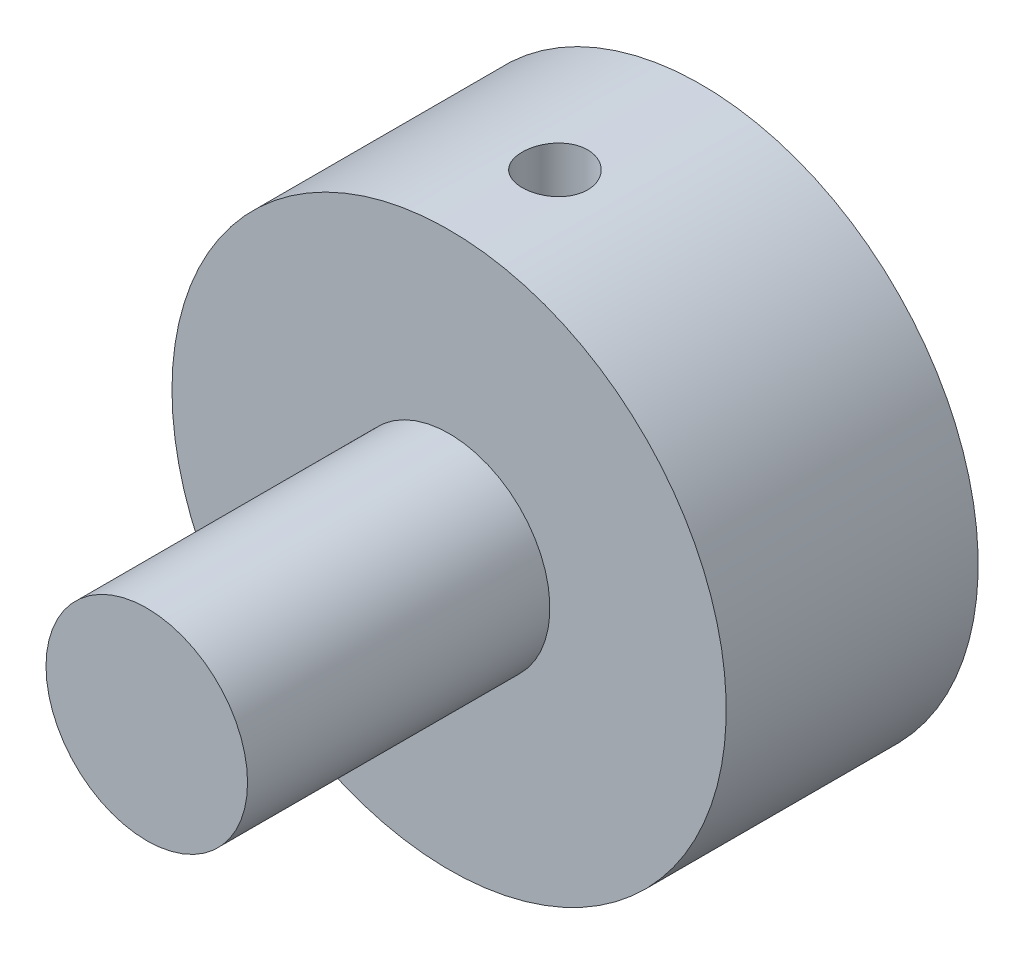
ISO-10303-21;
HEADER;
FILE_DESCRIPTION(('STEP AP214'),'2;1');
FILE_NAME('part.step','',(''),(''),'','','');
FILE_SCHEMA(('AUTOMOTIVE_DESIGN { 1 0 10303 214 1 1 1 1 }'));
ENDSEC;
DATA;
#1=APPLICATION_CONTEXT('core data for automotive mechanical design processes');
#2=APPLICATION_PROTOCOL_DEFINITION('international standard','automotive_design',2000,#1);
#3=PRODUCT_CONTEXT('',#1,'mechanical');
#4=PRODUCT('Part','Part','',(#3));
#5=PRODUCT_RELATED_PRODUCT_CATEGORY('part','',(#4));
#6=PRODUCT_DEFINITION_FORMATION('','',#4);
#7=PRODUCT_DEFINITION_CONTEXT('part definition',#1,'design');
#8=PRODUCT_DEFINITION('design','',#6,#7);
#9=PRODUCT_DEFINITION_SHAPE('','',#8);
#10=(LENGTH_UNIT() NAMED_UNIT(*) SI_UNIT(.MILLI.,.METRE.));
#11=(NAMED_UNIT(*) PLANE_ANGLE_UNIT() SI_UNIT($,.RADIAN.));
#12=(NAMED_UNIT(*) SI_UNIT($,.STERADIAN.) SOLID_ANGLE_UNIT());
#13=UNCERTAINTY_MEASURE_WITH_UNIT(LENGTH_MEASURE(1.E-05),#10,'distance_accuracy_value','');
#14=(GEOMETRIC_REPRESENTATION_CONTEXT(3) GLOBAL_UNCERTAINTY_ASSIGNED_CONTEXT((#13)) GLOBAL_UNIT_ASSIGNED_CONTEXT((#10,
#11,#12)) REPRESENTATION_CONTEXT('',''));
#15=CARTESIAN_POINT('',(0.,0.,0.));
#16=DIRECTION('',(0.,0.,1.));
#17=DIRECTION('',(1.,0.,0.));
#18=AXIS2_PLACEMENT_3D('',#15,#16,#17);
#19=CARTESIAN_POINT('',(0.,0.,-10.));
#20=DIRECTION('',(0.,0.,1.));
#21=DIRECTION('',(1.,0.,0.));
#22=AXIS2_PLACEMENT_3D('',#19,#20,#21);
#23=CYLINDRICAL_SURFACE('',#22,11.);
#24=CARTESIAN_POINT('',(0.,0.,-10.));
#25=DIRECTION('',(0.,0.,-1.));
#26=DIRECTION('',(-1.,0.,0.));
#27=AXIS2_PLACEMENT_3D('',#24,#25,#26);
#28=CIRCLE('',#27,11.);
#29=CARTESIAN_POINT('',(-11.,0.,-10.));
#30=VERTEX_POINT('',#29);
#31=EDGE_CURVE('E48',#30,#30,#28,.T.);
#32=ORIENTED_EDGE('',*,*,#31,.F.);
#33=EDGE_LOOP('',(#32));
#34=FACE_BOUND('',#33,.T.);
#35=CARTESIAN_POINT('',(0.,0.,0.));
#36=DIRECTION('',(0.,0.,-1.));
#37=DIRECTION('',(-1.,0.,0.));
#38=AXIS2_PLACEMENT_3D('',#35,#36,#37);
#39=CIRCLE('',#38,11.);
#40=CARTESIAN_POINT('',(-11.,0.,0.));
#41=VERTEX_POINT('',#40);
#42=EDGE_CURVE('E85',#41,#41,#39,.T.);
#43=ORIENTED_EDGE('',*,*,#42,.T.);
#44=EDGE_LOOP('',(#43));
#45=FACE_BOUND('',#44,.T.);
#46=CARTESIAN_POINT('',(0.,-11.,-5.5));
#47=CARTESIAN_POINT('',(0.0727494768905816,-10.9999990312112,-5.49999689043474));
#48=CARTESIAN_POINT('',(0.145545192550666,-10.9992706614709,-5.49387270352264));
#49=CARTESIAN_POINT('',(0.289113168880403,-10.9964351044145,-5.46953754968632));
#50=CARTESIAN_POINT('',(0.359883199191161,-10.9943264540284,-5.451313757126));
#51=CARTESIAN_POINT('',(0.497300409481032,-10.9889680275019,-5.40332191151412));
#52=CARTESIAN_POINT('',(0.563950248196861,-10.9857189964771,-5.37356139514225));
#53=CARTESIAN_POINT('',(0.691296055889904,-10.9784417367287,-5.30335685456351));
#54=CARTESIAN_POINT('',(0.751993091141445,-10.9744136479365,-5.26291474846809));
#55=CARTESIAN_POINT('',(0.866023695567072,-10.9660061700603,-5.17228101061325));
#56=CARTESIAN_POINT('',(0.919323606954438,-10.9616253099023,-5.12204716466504));
#57=CARTESIAN_POINT('',(1.01675725960503,-10.9530179882208,-5.01334641552687));
#58=CARTESIAN_POINT('',(1.06089054693033,-10.948791534352,-4.95487910485017));
#59=CARTESIAN_POINT('',(1.13886191535622,-10.9409569601673,-4.83115449874434));
#60=CARTESIAN_POINT('',(1.17266875012022,-10.9373507306663,-4.76587738181322));
#61=CARTESIAN_POINT('',(1.2288280313611,-10.9311840445561,-4.63052274291889));
#62=CARTESIAN_POINT('',(1.25118086720608,-10.9286235523985,-4.56044538422728));
#63=CARTESIAN_POINT('',(1.28369601272177,-10.9248521250124,-4.41782732097491));
#64=CARTESIAN_POINT('',(1.29391490220159,-10.9236349279771,-4.34529968435054));
#65=CARTESIAN_POINT('',(1.30204710387324,-10.9226686786803,-4.19954942003713));
#66=CARTESIAN_POINT('',(1.29996086023488,-10.9229195734261,-4.12632681752906));
#67=CARTESIAN_POINT('',(1.28358851529818,-10.9248554310403,-3.98165818553043));
#68=CARTESIAN_POINT('',(1.26936457631086,-10.9265330867104,-3.91020500941492));
#69=CARTESIAN_POINT('',(1.22921751655204,-10.9311220375995,-3.77070700901698));
#70=CARTESIAN_POINT('',(1.2032941818201,-10.9340333553799,-3.70266224709346));
#71=CARTESIAN_POINT('',(1.1404168556107,-10.9407699249733,-3.57171854277592));
#72=CARTESIAN_POINT('',(1.10343568479149,-10.9445974240138,-3.50883277184191));
#73=CARTESIAN_POINT('',(1.01951191357785,-10.9527333151062,-3.39013641747656));
#74=CARTESIAN_POINT('',(0.972568905739333,-10.9570417268242,-3.33432612358493));
#75=CARTESIAN_POINT('',(0.869708703065063,-10.9656865074784,-3.23100403962822));
#76=CARTESIAN_POINT('',(0.813737896500989,-10.9700228848098,-3.18354560601262));
#77=CARTESIAN_POINT('',(0.69459595339277,-10.978210050885,-3.09868929906653));
#78=CARTESIAN_POINT('',(0.631424803102416,-10.9820608387015,-3.0612914449432));
#79=CARTESIAN_POINT('',(0.499635452319628,-10.9888449845918,-2.99761848868541));
#80=CARTESIAN_POINT('',(0.431015713718819,-10.9917780824437,-2.97134654068803));
#81=CARTESIAN_POINT('',(0.290296457817578,-10.9963939368999,-2.93071255704131));
#82=CARTESIAN_POINT('',(0.218197086182594,-10.9980767457959,-2.91635002329334));
#83=CARTESIAN_POINT('',(0.0730267567288144,-10.9999956441566,-2.90001129002545));
#84=CARTESIAN_POINT('',(-3.58154861042988E-05,-11.0002403226599,-2.89796155237979));
#85=CARTESIAN_POINT('',(-0.14546342098688,-10.9992785350834,-2.90611279918727));
#86=CARTESIAN_POINT('',(-0.217828467492386,-10.9980720965601,-2.91631355100466));
#87=CARTESIAN_POINT('',(-0.359591250333168,-10.9943490183002,-2.94861514572982));
#88=CARTESIAN_POINT('',(-0.428997043368642,-10.9918362193838,-2.97068111030406));
#89=CARTESIAN_POINT('',(-0.563122721157106,-10.9857819039296,-3.02605062067911));
#90=CARTESIAN_POINT('',(-0.627842462263306,-10.9822403558731,-3.05935451079162));
#91=CARTESIAN_POINT('',(-0.751088508167394,-10.9745023331056,-3.1364337271877));
#92=CARTESIAN_POINT('',(-0.809584736198243,-10.9703029007432,-3.18025684288468));
#93=CARTESIAN_POINT('',(-0.918417716465528,-10.9617286405149,-3.27706265749298));
#94=CARTESIAN_POINT('',(-0.968754180190322,-10.957353806454,-3.33004568014199));
#95=CARTESIAN_POINT('',(-1.06009804270344,-10.9488955022061,-3.44399036250786));
#96=CARTESIAN_POINT('',(-1.10105683453724,-10.9448136221904,-3.50499112310959));
#97=CARTESIAN_POINT('',(-1.17214737626393,-10.9374290101762,-3.63304904551423));
#98=CARTESIAN_POINT('',(-1.20227932350859,-10.9341262639761,-3.70010609689515));
#99=CARTESIAN_POINT('',(-1.2507813537781,-10.9286844724523,-3.83821336780811));
#100=CARTESIAN_POINT('',(-1.26917928653159,-10.9265426735438,-3.90925369367654));
#101=CARTESIAN_POINT('',(-1.29378093493553,-10.9236572091523,-4.05344217506323));
#102=CARTESIAN_POINT('',(-1.29998515307633,-10.9229134860561,-4.12659024359754));
#103=CARTESIAN_POINT('',(-1.30001470266712,-10.9229099306832,-4.27243438919673));
#104=CARTESIAN_POINT('',(-1.29391639146437,-10.923640945244,-4.34513046245462));
#105=CARTESIAN_POINT('',(-1.26967521713931,-10.9264848684212,-4.48845697313083));
#106=CARTESIAN_POINT('',(-1.25153234866953,-10.9285977776512,-4.55908740963205));
#107=CARTESIAN_POINT('',(-1.20374014378666,-10.9339646748663,-4.69627040323191));
#108=CARTESIAN_POINT('',(-1.17409407204627,-10.9372183390736,-4.7628241111291));
#109=CARTESIAN_POINT('',(-1.10414456832618,-10.9445007137186,-4.89002412290383));
#110=CARTESIAN_POINT('',(-1.06384105909829,-10.948529429774,-4.95067038395811));
#111=CARTESIAN_POINT('',(-0.973436251948036,-10.9569379508121,-5.06472472133437));
#112=CARTESIAN_POINT('',(-0.923278008114739,-10.9613197046169,-5.11808751857422));
#113=CARTESIAN_POINT('',(-0.814705196272106,-10.9699231780461,-5.21566902795511));
#114=CARTESIAN_POINT('',(-0.756288676050399,-10.9741448595301,-5.25988557186539));
#115=CARTESIAN_POINT('',(-0.632631165337231,-10.9819682231344,-5.33804567112367));
#116=CARTESIAN_POINT('',(-0.567367556583463,-10.9855677393322,-5.37195363848805));
#117=CARTESIAN_POINT('',(-0.432068101790246,-10.9917189086474,-5.42828142995592));
#118=CARTESIAN_POINT('',(-0.362037595411305,-10.9942717124344,-5.45071387606243));
#119=CARTESIAN_POINT('',(-0.243028617051212,-10.9974187203314,-5.47801784243112));
#120=CARTESIAN_POINT('',(-0.194803860176204,-10.9983820444033,-5.48624947853536));
#121=CARTESIAN_POINT('',(-0.0977263557791346,-10.9996730076426,-5.49724158449422));
#122=CARTESIAN_POINT('',(-0.0488736122395752,-11.0000006508392,-5.5000020890279));
#123=CARTESIAN_POINT('',(0.,-11.,-5.5));
#124=B_SPLINE_CURVE_WITH_KNOTS('',3,(#46,#47,#48,#49,#50,#51,#52,#53,#54,#55,#56,#57,#58,#59,
#60,#61,#62,#63,#64,#65,#66,#67,#68,#69,#70,#71,#72,#73,#74,#75,#76,#77,#78,#79,#80,#81,#82,#83,
#84,#85,#86,#87,#88,#89,#90,#91,#92,#93,#94,#95,#96,#97,#98,#99,#100,#101,#102,#103,#104,#105,
#106,#107,#108,#109,#110,#111,#112,#113,#114,#115,#116,#117,#118,#119,#120,#121,#122,#123),
.UNSPECIFIED.,.T.,.F.,(4,2,2,2,2,2,2,2,2,2,2,2,2,2,2,2,2,2,2,2,2,2,2,2,2,2,2,2,2,2,2,2,2,2,2,2,
2,2,4),(0.,0.218069926407116,0.436371377745121,0.654530457382222,0.872650388420982,
1.0917323514956,1.31082516108388,1.53057449218949,1.75031635262379,1.96902949602339,
2.18773474473536,2.40532658714841,2.6229224090775,2.84105752438907,3.05920156325523,
3.27869228008531,3.49818341595314,3.71773673484006,3.93728087067859,4.15551246587513,
4.37373991693764,4.59132935755034,4.80892546535406,5.02752948411332,5.24614123055344,
5.46586166518144,5.68557809454121,5.90477108496094,6.12395504247506,6.34178279007035,
6.55961063437558,6.77737670309821,6.9951443502958,7.21420948916307,7.43332650072316,
7.65319159100822,7.87281432741204,8.01931617231818,8.16581708861156),.UNSPECIFIED.);
#125=CARTESIAN_POINT('',(0.,-11.,-5.5));
#126=VERTEX_POINT('',#125);
#127=EDGE_CURVE('E51',#126,#126,#124,.T.);
#128=ORIENTED_EDGE('',*,*,#127,.F.);
#129=EDGE_LOOP('',(#128));
#130=FACE_BOUND('',#129,.T.);
#131=CARTESIAN_POINT('',(0.,11.,-5.5));
#132=CARTESIAN_POINT('',(-0.0727494768905816,10.9999990312112,-5.49999689043474));
#133=CARTESIAN_POINT('',(-0.145545192550666,10.9992706614709,-5.49387270352264));
#134=CARTESIAN_POINT('',(-0.289113168880403,10.9964351044145,-5.46953754968632));
#135=CARTESIAN_POINT('',(-0.359883199191161,10.9943264540284,-5.451313757126));
#136=CARTESIAN_POINT('',(-0.497300409481032,10.9889680275019,-5.40332191151412));
#137=CARTESIAN_POINT('',(-0.563950248196861,10.9857189964771,-5.37356139514225));
#138=CARTESIAN_POINT('',(-0.691296055889904,10.9784417367287,-5.30335685456351));
#139=CARTESIAN_POINT('',(-0.751993091141445,10.9744136479365,-5.26291474846809));
#140=CARTESIAN_POINT('',(-0.866023695567072,10.9660061700603,-5.17228101061325));
#141=CARTESIAN_POINT('',(-0.919323606954438,10.9616253099023,-5.12204716466504));
#142=CARTESIAN_POINT('',(-1.01675725960503,10.9530179882208,-5.01334641552687));
#143=CARTESIAN_POINT('',(-1.06089054693033,10.948791534352,-4.95487910485017));
#144=CARTESIAN_POINT('',(-1.13886191535622,10.9409569601673,-4.83115449874434));
#145=CARTESIAN_POINT('',(-1.17266875012022,10.9373507306663,-4.76587738181322));
#146=CARTESIAN_POINT('',(-1.2288280313611,10.9311840445561,-4.63052274291889));
#147=CARTESIAN_POINT('',(-1.25118086720608,10.9286235523985,-4.56044538422728));
#148=CARTESIAN_POINT('',(-1.28369601272177,10.9248521250124,-4.41782732097491));
#149=CARTESIAN_POINT('',(-1.29391490220159,10.9236349279771,-4.34529968435054));
#150=CARTESIAN_POINT('',(-1.30204710387324,10.9226686786803,-4.19954942003713));
#151=CARTESIAN_POINT('',(-1.29996086023488,10.9229195734261,-4.12632681752906));
#152=CARTESIAN_POINT('',(-1.28358851529818,10.9248554310403,-3.98165818553043));
#153=CARTESIAN_POINT('',(-1.26936457631086,10.9265330867104,-3.91020500941492));
#154=CARTESIAN_POINT('',(-1.22921751655204,10.9311220375995,-3.77070700901698));
#155=CARTESIAN_POINT('',(-1.2032941818201,10.9340333553799,-3.70266224709346));
#156=CARTESIAN_POINT('',(-1.1404168556107,10.9407699249733,-3.57171854277592));
#157=CARTESIAN_POINT('',(-1.10343568479149,10.9445974240138,-3.50883277184191));
#158=CARTESIAN_POINT('',(-1.01951191357785,10.9527333151062,-3.39013641747656));
#159=CARTESIAN_POINT('',(-0.972568905739333,10.9570417268242,-3.33432612358493));
#160=CARTESIAN_POINT('',(-0.869708703065063,10.9656865074784,-3.23100403962822));
#161=CARTESIAN_POINT('',(-0.813737896500989,10.9700228848098,-3.18354560601262));
#162=CARTESIAN_POINT('',(-0.69459595339277,10.978210050885,-3.09868929906653));
#163=CARTESIAN_POINT('',(-0.631424803102416,10.9820608387015,-3.0612914449432));
#164=CARTESIAN_POINT('',(-0.499635452319628,10.9888449845918,-2.99761848868541));
#165=CARTESIAN_POINT('',(-0.431015713718819,10.9917780824437,-2.97134654068803));
#166=CARTESIAN_POINT('',(-0.290296457817578,10.9963939368999,-2.93071255704131));
#167=CARTESIAN_POINT('',(-0.218197086182594,10.9980767457959,-2.91635002329334));
#168=CARTESIAN_POINT('',(-0.0730267567288144,10.9999956441566,-2.90001129002545));
#169=CARTESIAN_POINT('',(3.58154861042988E-05,11.0002403226599,-2.89796155237979));
#170=CARTESIAN_POINT('',(0.14546342098688,10.9992785350834,-2.90611279918727));
#171=CARTESIAN_POINT('',(0.217828467492386,10.9980720965601,-2.91631355100466));
#172=CARTESIAN_POINT('',(0.359591250333168,10.9943490183002,-2.94861514572982));
#173=CARTESIAN_POINT('',(0.428997043368642,10.9918362193838,-2.97068111030406));
#174=CARTESIAN_POINT('',(0.563122721157106,10.9857819039296,-3.02605062067911));
#175=CARTESIAN_POINT('',(0.627842462263306,10.9822403558731,-3.05935451079162));
#176=CARTESIAN_POINT('',(0.751088508167394,10.9745023331056,-3.1364337271877));
#177=CARTESIAN_POINT('',(0.809584736198243,10.9703029007432,-3.18025684288468));
#178=CARTESIAN_POINT('',(0.918417716465528,10.9617286405149,-3.27706265749298));
#179=CARTESIAN_POINT('',(0.968754180190322,10.957353806454,-3.33004568014199));
#180=CARTESIAN_POINT('',(1.06009804270344,10.9488955022061,-3.44399036250786));
#181=CARTESIAN_POINT('',(1.10105683453724,10.9448136221904,-3.50499112310959));
#182=CARTESIAN_POINT('',(1.17214737626393,10.9374290101762,-3.63304904551423));
#183=CARTESIAN_POINT('',(1.20227932350859,10.9341262639761,-3.70010609689515));
#184=CARTESIAN_POINT('',(1.2507813537781,10.9286844724523,-3.83821336780811));
#185=CARTESIAN_POINT('',(1.26917928653159,10.9265426735438,-3.90925369367654));
#186=CARTESIAN_POINT('',(1.29378093493553,10.9236572091523,-4.05344217506323));
#187=CARTESIAN_POINT('',(1.29998515307633,10.9229134860561,-4.12659024359754));
#188=CARTESIAN_POINT('',(1.30001470266712,10.9229099306832,-4.27243438919673));
#189=CARTESIAN_POINT('',(1.29391639146437,10.923640945244,-4.34513046245462));
#190=CARTESIAN_POINT('',(1.26967521713931,10.9264848684212,-4.48845697313083));
#191=CARTESIAN_POINT('',(1.25153234866953,10.9285977776512,-4.55908740963205));
#192=CARTESIAN_POINT('',(1.20374014378666,10.9339646748663,-4.69627040323191));
#193=CARTESIAN_POINT('',(1.17409407204627,10.9372183390736,-4.7628241111291));
#194=CARTESIAN_POINT('',(1.10414456832618,10.9445007137186,-4.89002412290383));
#195=CARTESIAN_POINT('',(1.06384105909829,10.948529429774,-4.95067038395811));
#196=CARTESIAN_POINT('',(0.973436251948036,10.9569379508121,-5.06472472133437));
#197=CARTESIAN_POINT('',(0.923278008114739,10.9613197046169,-5.11808751857422));
#198=CARTESIAN_POINT('',(0.814705196272106,10.9699231780461,-5.21566902795511));
#199=CARTESIAN_POINT('',(0.756288676050399,10.9741448595301,-5.25988557186539));
#200=CARTESIAN_POINT('',(0.632631165337231,10.9819682231344,-5.33804567112367));
#201=CARTESIAN_POINT('',(0.567367556583463,10.9855677393322,-5.37195363848805));
#202=CARTESIAN_POINT('',(0.432068101790246,10.9917189086474,-5.42828142995592));
#203=CARTESIAN_POINT('',(0.362037595411305,10.9942717124344,-5.45071387606243));
#204=CARTESIAN_POINT('',(0.243028617051212,10.9974187203314,-5.47801784243112));
#205=CARTESIAN_POINT('',(0.194803860176204,10.9983820444033,-5.48624947853536));
#206=CARTESIAN_POINT('',(0.0977263557791346,10.9996730076426,-5.49724158449422));
#207=CARTESIAN_POINT('',(0.0488736122395752,11.0000006508392,-5.5000020890279));
#208=CARTESIAN_POINT('',(0.,11.,-5.5));
#209=B_SPLINE_CURVE_WITH_KNOTS('',3,(#131,#132,#133,#134,#135,#136,#137,#138,#139,#140,#141,
#142,#143,#144,#145,#146,#147,#148,#149,#150,#151,#152,#153,#154,#155,#156,#157,#158,#159,#160,
#161,#162,#163,#164,#165,#166,#167,#168,#169,#170,#171,#172,#173,#174,#175,#176,#177,#178,#179,
#180,#181,#182,#183,#184,#185,#186,#187,#188,#189,#190,#191,#192,#193,#194,#195,#196,#197,#198,
#199,#200,#201,#202,#203,#204,#205,#206,#207,#208),.UNSPECIFIED.,.T.,.F.,(4,2,2,2,2,2,2,2,2,2,2,
2,2,2,2,2,2,2,2,2,2,2,2,2,2,2,2,2,2,2,2,2,2,2,2,2,2,2,4),(0.,0.218069926407116,
0.436371377745121,0.654530457382222,0.872650388420982,1.0917323514956,1.31082516108388,
1.53057449218949,1.75031635262379,1.96902949602339,2.18773474473536,2.40532658714841,
2.6229224090775,2.84105752438907,3.05920156325523,3.27869228008531,3.49818341595314,
3.71773673484006,3.93728087067859,4.15551246587513,4.37373991693764,4.59132935755034,
4.80892546535406,5.02752948411332,5.24614123055344,5.46586166518144,5.68557809454121,
5.90477108496094,6.12395504247506,6.34178279007035,6.55961063437558,6.77737670309821,
6.9951443502958,7.21420948916307,7.43332650072316,7.65319159100822,7.87281432741204,
8.01931617231818,8.16581708861156),.UNSPECIFIED.);
#210=CARTESIAN_POINT('',(0.,11.,-5.5));
#211=VERTEX_POINT('',#210);
#212=EDGE_CURVE('E35',#211,#211,#209,.T.);
#213=ORIENTED_EDGE('',*,*,#212,.F.);
#214=EDGE_LOOP('',(#213));
#215=FACE_BOUND('',#214,.T.);
#216=ADVANCED_FACE('F31',(#34,#45,#130,#215),#23,.T.);
#217=CARTESIAN_POINT('',(0.,0.,12.));
#218=DIRECTION('',(0.,0.,-1.));
#219=DIRECTION('',(-1.,0.,0.));
#220=AXIS2_PLACEMENT_3D('',#217,#218,#219);
#221=CYLINDRICAL_SURFACE('',#220,4.);
#222=CARTESIAN_POINT('',(0.,0.,12.));
#223=DIRECTION('',(0.,0.,1.));
#224=DIRECTION('',(1.,0.,0.));
#225=AXIS2_PLACEMENT_3D('',#222,#223,#224);
#226=CIRCLE('',#225,4.);
#227=CARTESIAN_POINT('',(4.,0.,12.));
#228=VERTEX_POINT('',#227);
#229=EDGE_CURVE('E10',#228,#228,#226,.T.);
#230=ORIENTED_EDGE('',*,*,#229,.F.);
#231=EDGE_LOOP('',(#230));
#232=FACE_BOUND('',#231,.T.);
#233=CARTESIAN_POINT('',(0.,0.,0.));
#234=DIRECTION('',(0.,0.,-1.));
#235=DIRECTION('',(-1.,0.,0.));
#236=AXIS2_PLACEMENT_3D('',#233,#234,#235);
#237=CIRCLE('',#236,4.);
#238=CARTESIAN_POINT('',(-4.,0.,0.));
#239=VERTEX_POINT('',#238);
#240=EDGE_CURVE('E43',#239,#239,#237,.T.);
#241=ORIENTED_EDGE('',*,*,#240,.F.);
#242=EDGE_LOOP('',(#241));
#243=FACE_BOUND('',#242,.T.);
#244=ADVANCED_FACE('F33',(#232,#243),#221,.T.);
#245=CARTESIAN_POINT('',(0.,0.,12.));
#246=DIRECTION('',(0.,0.,1.));
#247=DIRECTION('',(1.,0.,0.));
#248=AXIS2_PLACEMENT_3D('',#245,#246,#247);
#249=PLANE('',#248);
#250=ORIENTED_EDGE('',*,*,#229,.T.);
#251=EDGE_LOOP('',(#250));
#252=FACE_BOUND('',#251,.T.);
#253=ADVANCED_FACE('F66',(#252),#249,.T.);
#254=CARTESIAN_POINT('',(0.,0.,-10.));
#255=DIRECTION('',(0.,0.,-1.));
#256=DIRECTION('',(-1.,0.,0.));
#257=AXIS2_PLACEMENT_3D('',#254,#255,#256);
#258=PLANE('',#257);
#259=ORIENTED_EDGE('',*,*,#31,.T.);
#260=EDGE_LOOP('',(#259));
#261=FACE_BOUND('',#260,.T.);
#262=ADVANCED_FACE('F63',(#261),#258,.T.);
#263=CARTESIAN_POINT('',(0.,0.,0.));
#264=DIRECTION('',(0.,0.,-1.));
#265=DIRECTION('',(-1.,0.,0.));
#266=AXIS2_PLACEMENT_3D('',#263,#264,#265);
#267=PLANE('',#266);
#268=ORIENTED_EDGE('',*,*,#240,.T.);
#269=EDGE_LOOP('',(#268));
#270=FACE_BOUND('',#269,.T.);
#271=ORIENTED_EDGE('',*,*,#42,.F.);
#272=EDGE_LOOP('',(#271));
#273=FACE_BOUND('',#272,.T.);
#274=ADVANCED_FACE('F61',(#270,#273),#267,.F.);
#275=CARTESIAN_POINT('',(0.,20.,-4.2));
#276=DIRECTION('',(0.,-1.,0.));
#277=DIRECTION('',(0.,0.,-1.));
#278=AXIS2_PLACEMENT_3D('',#275,#276,#277);
#279=CYLINDRICAL_SURFACE('',#278,1.3);
#280=ORIENTED_EDGE('',*,*,#127,.T.);
#281=EDGE_LOOP('',(#280));
#282=FACE_BOUND('',#281,.T.);
#283=ORIENTED_EDGE('',*,*,#212,.T.);
#284=EDGE_LOOP('',(#283));
#285=FACE_BOUND('',#284,.T.);
#286=ADVANCED_FACE('F57',(#282,#285),#279,.F.);
#287=CLOSED_SHELL('',(#216,#244,#253,#262,#274,#286));
#288=MANIFOLD_SOLID_BREP('B2',#287);
#289=ADVANCED_BREP_SHAPE_REPRESENTATION('',(#18,#288),#14);
#290=SHAPE_DEFINITION_REPRESENTATION(#9,#289);
ENDSEC;
END-ISO-10303-21;
